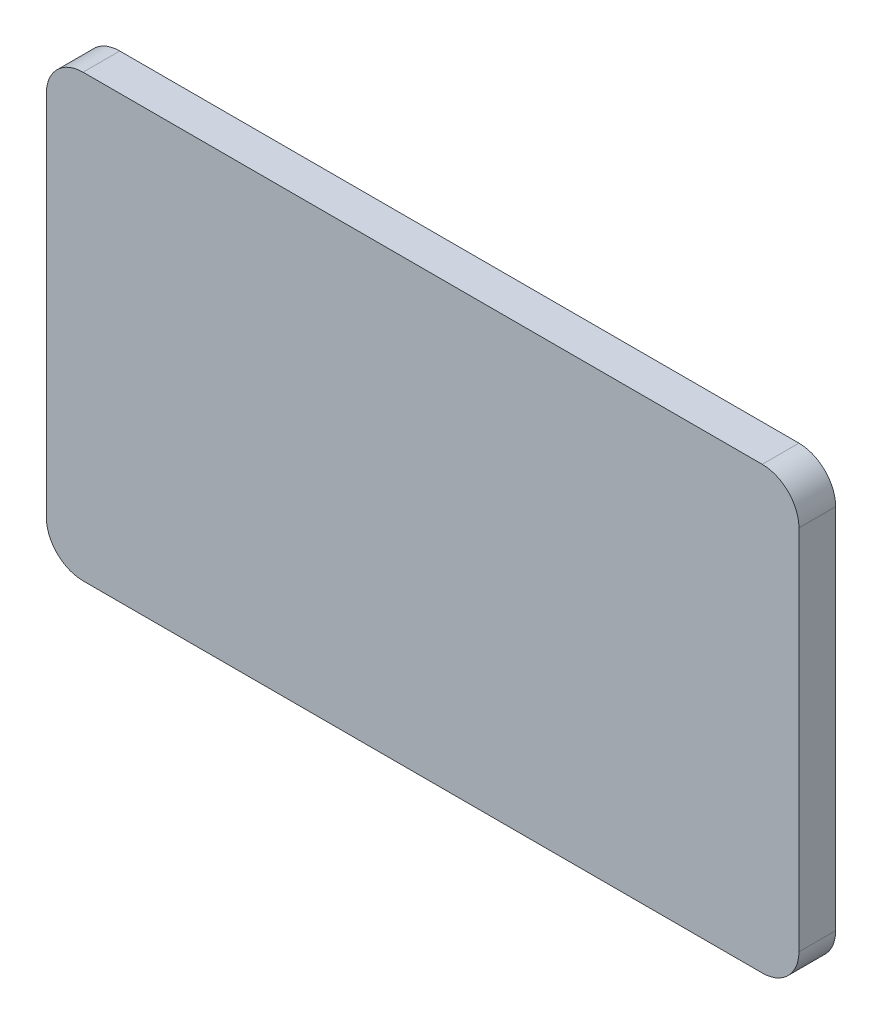
ISO-10303-21;
HEADER;
FILE_DESCRIPTION(('STEP AP214'),'2;1');
FILE_NAME('part.step','',(''),(''),'','','');
FILE_SCHEMA(('AUTOMOTIVE_DESIGN { 1 0 10303 214 1 1 1 1 }'));
ENDSEC;
DATA;
#1=APPLICATION_CONTEXT('core data for automotive mechanical design processes');
#2=APPLICATION_PROTOCOL_DEFINITION('international standard','automotive_design',2000,#1);
#3=PRODUCT_CONTEXT('',#1,'mechanical');
#4=PRODUCT('Part','Part','',(#3));
#5=PRODUCT_RELATED_PRODUCT_CATEGORY('part','',(#4));
#6=PRODUCT_DEFINITION_FORMATION('','',#4);
#7=PRODUCT_DEFINITION_CONTEXT('part definition',#1,'design');
#8=PRODUCT_DEFINITION('design','',#6,#7);
#9=PRODUCT_DEFINITION_SHAPE('','',#8);
#10=(LENGTH_UNIT() NAMED_UNIT(*) SI_UNIT(.MILLI.,.METRE.));
#11=(NAMED_UNIT(*) PLANE_ANGLE_UNIT() SI_UNIT($,.RADIAN.));
#12=(NAMED_UNIT(*) SI_UNIT($,.STERADIAN.) SOLID_ANGLE_UNIT());
#13=UNCERTAINTY_MEASURE_WITH_UNIT(LENGTH_MEASURE(1.E-05),#10,'distance_accuracy_value','');
#14=(GEOMETRIC_REPRESENTATION_CONTEXT(3) GLOBAL_UNCERTAINTY_ASSIGNED_CONTEXT((#13)) GLOBAL_UNIT_ASSIGNED_CONTEXT((#10,
#11,#12)) REPRESENTATION_CONTEXT('',''));
#15=CARTESIAN_POINT('',(0.,0.,0.));
#16=DIRECTION('',(0.,0.,1.));
#17=DIRECTION('',(1.,0.,0.));
#18=AXIS2_PLACEMENT_3D('',#15,#16,#17);
#19=CARTESIAN_POINT('',(0.,0.,2.));
#20=DIRECTION('',(1.,0.,0.));
#21=DIRECTION('',(0.,1.,0.));
#22=AXIS2_PLACEMENT_3D('',#19,#20,#21);
#23=PLANE('',#22);
#24=DIRECTION('',(0.,-1.,0.));
#25=VECTOR('',#24,1.);
#26=CARTESIAN_POINT('',(0.,0.,0.));
#27=LINE('',#26,#25);
#28=CARTESIAN_POINT('',(0.,-2.,0.));
#29=VERTEX_POINT('',#28);
#30=CARTESIAN_POINT('',(0.,-22.,0.));
#31=VERTEX_POINT('',#30);
#32=EDGE_CURVE('E142',#29,#31,#27,.T.);
#33=ORIENTED_EDGE('',*,*,#32,.T.);
#34=DIRECTION('',(0.,0.,-1.));
#35=VECTOR('',#34,1.);
#36=CARTESIAN_POINT('',(0.,-22.,2.));
#37=LINE('',#36,#35);
#38=CARTESIAN_POINT('',(0.,-22.,2.));
#39=VERTEX_POINT('',#38);
#40=EDGE_CURVE('E176',#31,#39,#37,.F.);
#41=ORIENTED_EDGE('',*,*,#40,.T.);
#42=DIRECTION('',(0.,-1.,0.));
#43=VECTOR('',#42,1.);
#44=CARTESIAN_POINT('',(0.,0.,2.));
#45=LINE('',#44,#43);
#46=CARTESIAN_POINT('',(0.,-2.,2.));
#47=VERTEX_POINT('',#46);
#48=EDGE_CURVE('E140',#47,#39,#45,.T.);
#49=ORIENTED_EDGE('',*,*,#48,.F.);
#50=DIRECTION('',(0.,0.,-1.));
#51=VECTOR('',#50,1.);
#52=CARTESIAN_POINT('',(0.,-2.,2.));
#53=LINE('',#52,#51);
#54=EDGE_CURVE('E172',#47,#29,#53,.T.);
#55=ORIENTED_EDGE('',*,*,#54,.T.);
#56=EDGE_LOOP('',(#33,#41,#49,#55));
#57=FACE_BOUND('',#56,.T.);
#58=ADVANCED_FACE('F41',(#57),#23,.F.);
#59=CARTESIAN_POINT('',(0.,-24.,2.));
#60=DIRECTION('',(0.,1.,0.));
#61=DIRECTION('',(0.,0.,1.));
#62=AXIS2_PLACEMENT_3D('',#59,#60,#61);
#63=PLANE('',#62);
#64=DIRECTION('',(1.,0.,0.));
#65=VECTOR('',#64,1.);
#66=CARTESIAN_POINT('',(0.,-24.,0.));
#67=LINE('',#66,#65);
#68=CARTESIAN_POINT('',(2.,-24.,0.));
#69=VERTEX_POINT('',#68);
#70=CARTESIAN_POINT('',(39.,-24.,0.));
#71=VERTEX_POINT('',#70);
#72=EDGE_CURVE('E136',#69,#71,#67,.T.);
#73=ORIENTED_EDGE('',*,*,#72,.T.);
#74=DIRECTION('',(0.,0.,-1.));
#75=VECTOR('',#74,1.);
#76=CARTESIAN_POINT('',(39.,-24.,2.));
#77=LINE('',#76,#75);
#78=CARTESIAN_POINT('',(39.,-24.,2.));
#79=VERTEX_POINT('',#78);
#80=EDGE_CURVE('E112',#71,#79,#77,.F.);
#81=ORIENTED_EDGE('',*,*,#80,.T.);
#82=DIRECTION('',(1.,0.,0.));
#83=VECTOR('',#82,1.);
#84=CARTESIAN_POINT('',(0.,-24.,2.));
#85=LINE('',#84,#83);
#86=CARTESIAN_POINT('',(2.,-24.,2.));
#87=VERTEX_POINT('',#86);
#88=EDGE_CURVE('E195',#87,#79,#85,.T.);
#89=ORIENTED_EDGE('',*,*,#88,.F.);
#90=DIRECTION('',(0.,0.,-1.));
#91=VECTOR('',#90,1.);
#92=CARTESIAN_POINT('',(2.,-24.,2.));
#93=LINE('',#92,#91);
#94=EDGE_CURVE('E118',#87,#69,#93,.T.);
#95=ORIENTED_EDGE('',*,*,#94,.T.);
#96=EDGE_LOOP('',(#73,#81,#89,#95));
#97=FACE_BOUND('',#96,.T.);
#98=ADVANCED_FACE('F216',(#97),#63,.F.);
#99=CARTESIAN_POINT('',(41.,0.,2.));
#100=DIRECTION('',(-1.,0.,0.));
#101=DIRECTION('',(0.,0.,1.));
#102=AXIS2_PLACEMENT_3D('',#99,#100,#101);
#103=PLANE('',#102);
#104=DIRECTION('',(0.,1.,0.));
#105=VECTOR('',#104,1.);
#106=CARTESIAN_POINT('',(41.,0.,2.));
#107=LINE('',#106,#105);
#108=CARTESIAN_POINT('',(41.,-22.,2.));
#109=VERTEX_POINT('',#108);
#110=CARTESIAN_POINT('',(41.,-2.,2.));
#111=VERTEX_POINT('',#110);
#112=EDGE_CURVE('E127',#109,#111,#107,.T.);
#113=ORIENTED_EDGE('',*,*,#112,.F.);
#114=DIRECTION('',(0.,0.,-1.));
#115=VECTOR('',#114,1.);
#116=CARTESIAN_POINT('',(41.,-22.,2.));
#117=LINE('',#116,#115);
#118=CARTESIAN_POINT('',(41.,-22.,0.));
#119=VERTEX_POINT('',#118);
#120=EDGE_CURVE('E111',#109,#119,#117,.T.);
#121=ORIENTED_EDGE('',*,*,#120,.T.);
#122=DIRECTION('',(0.,1.,0.));
#123=VECTOR('',#122,1.);
#124=CARTESIAN_POINT('',(41.,0.,0.));
#125=LINE('',#124,#123);
#126=CARTESIAN_POINT('',(41.,-2.,0.));
#127=VERTEX_POINT('',#126);
#128=EDGE_CURVE('E125',#119,#127,#125,.T.);
#129=ORIENTED_EDGE('',*,*,#128,.T.);
#130=DIRECTION('',(0.,0.,-1.));
#131=VECTOR('',#130,1.);
#132=CARTESIAN_POINT('',(41.,-2.,2.));
#133=LINE('',#132,#131);
#134=EDGE_CURVE('E130',#127,#111,#133,.F.);
#135=ORIENTED_EDGE('',*,*,#134,.T.);
#136=EDGE_LOOP('',(#113,#121,#129,#135));
#137=FACE_BOUND('',#136,.T.);
#138=ADVANCED_FACE('F124',(#137),#103,.F.);
#139=CARTESIAN_POINT('',(0.,0.,2.));
#140=DIRECTION('',(0.,-1.,0.));
#141=DIRECTION('',(0.,0.,-1.));
#142=AXIS2_PLACEMENT_3D('',#139,#140,#141);
#143=PLANE('',#142);
#144=DIRECTION('',(-1.,0.,0.));
#145=VECTOR('',#144,1.);
#146=CARTESIAN_POINT('',(0.,0.,0.));
#147=LINE('',#146,#145);
#148=CARTESIAN_POINT('',(39.,0.,0.));
#149=VERTEX_POINT('',#148);
#150=CARTESIAN_POINT('',(2.,0.,0.));
#151=VERTEX_POINT('',#150);
#152=EDGE_CURVE('E135',#149,#151,#147,.T.);
#153=ORIENTED_EDGE('',*,*,#152,.T.);
#154=DIRECTION('',(0.,0.,-1.));
#155=VECTOR('',#154,1.);
#156=CARTESIAN_POINT('',(2.,0.,2.));
#157=LINE('',#156,#155);
#158=CARTESIAN_POINT('',(2.,0.,2.));
#159=VERTEX_POINT('',#158);
#160=EDGE_CURVE('E11',#151,#159,#157,.F.);
#161=ORIENTED_EDGE('',*,*,#160,.T.);
#162=DIRECTION('',(-1.,0.,0.));
#163=VECTOR('',#162,1.);
#164=CARTESIAN_POINT('',(0.,0.,2.));
#165=LINE('',#164,#163);
#166=CARTESIAN_POINT('',(39.,0.,2.));
#167=VERTEX_POINT('',#166);
#168=EDGE_CURVE('E147',#167,#159,#165,.T.);
#169=ORIENTED_EDGE('',*,*,#168,.F.);
#170=DIRECTION('',(0.,0.,-1.));
#171=VECTOR('',#170,1.);
#172=CARTESIAN_POINT('',(39.,0.,2.));
#173=LINE('',#172,#171);
#174=EDGE_CURVE('E50',#167,#149,#173,.T.);
#175=ORIENTED_EDGE('',*,*,#174,.T.);
#176=EDGE_LOOP('',(#153,#161,#169,#175));
#177=FACE_BOUND('',#176,.T.);
#178=ADVANCED_FACE('F181',(#177),#143,.F.);
#179=CARTESIAN_POINT('',(0.,0.,2.));
#180=DIRECTION('',(0.,0.,1.));
#181=DIRECTION('',(1.,0.,0.));
#182=AXIS2_PLACEMENT_3D('',#179,#180,#181);
#183=PLANE('',#182);
#184=ORIENTED_EDGE('',*,*,#88,.T.);
#185=CARTESIAN_POINT('',(39.,-22.,2.));
#186=DIRECTION('',(0.,0.,1.));
#187=DIRECTION('',(1.,0.,0.));
#188=AXIS2_PLACEMENT_3D('',#185,#186,#187);
#189=CIRCLE('',#188,2.);
#190=EDGE_CURVE('E169',#79,#109,#189,.T.);
#191=ORIENTED_EDGE('',*,*,#190,.T.);
#192=ORIENTED_EDGE('',*,*,#112,.T.);
#193=CARTESIAN_POINT('',(39.,-2.,2.));
#194=DIRECTION('',(0.,0.,1.));
#195=DIRECTION('',(1.,0.,0.));
#196=AXIS2_PLACEMENT_3D('',#193,#194,#195);
#197=CIRCLE('',#196,2.);
#198=EDGE_CURVE('E62',#111,#167,#197,.T.);
#199=ORIENTED_EDGE('',*,*,#198,.T.);
#200=ORIENTED_EDGE('',*,*,#168,.T.);
#201=CARTESIAN_POINT('',(2.,-2.,2.));
#202=DIRECTION('',(0.,0.,1.));
#203=DIRECTION('',(1.,0.,0.));
#204=AXIS2_PLACEMENT_3D('',#201,#202,#203);
#205=CIRCLE('',#204,2.);
#206=EDGE_CURVE('E163',#159,#47,#205,.T.);
#207=ORIENTED_EDGE('',*,*,#206,.T.);
#208=ORIENTED_EDGE('',*,*,#48,.T.);
#209=CARTESIAN_POINT('',(2.,-22.,2.));
#210=DIRECTION('',(0.,0.,1.));
#211=DIRECTION('',(1.,0.,0.));
#212=AXIS2_PLACEMENT_3D('',#209,#210,#211);
#213=CIRCLE('',#212,2.);
#214=EDGE_CURVE('E166',#39,#87,#213,.T.);
#215=ORIENTED_EDGE('',*,*,#214,.T.);
#216=EDGE_LOOP('',(#184,#191,#192,#199,#200,#207,#208,#215));
#217=FACE_BOUND('',#216,.T.);
#218=ADVANCED_FACE('F205',(#217),#183,.T.);
#219=CARTESIAN_POINT('',(0.,0.,0.));
#220=DIRECTION('',(0.,0.,1.));
#221=DIRECTION('',(1.,0.,0.));
#222=AXIS2_PLACEMENT_3D('',#219,#220,#221);
#223=PLANE('',#222);
#224=ORIENTED_EDGE('',*,*,#128,.F.);
#225=CARTESIAN_POINT('',(39.,-22.,0.));
#226=DIRECTION('',(0.,0.,1.));
#227=DIRECTION('',(1.,0.,0.));
#228=AXIS2_PLACEMENT_3D('',#225,#226,#227);
#229=CIRCLE('',#228,2.);
#230=EDGE_CURVE('E107',#119,#71,#229,.F.);
#231=ORIENTED_EDGE('',*,*,#230,.T.);
#232=ORIENTED_EDGE('',*,*,#72,.F.);
#233=CARTESIAN_POINT('',(2.,-22.,0.));
#234=DIRECTION('',(0.,0.,1.));
#235=DIRECTION('',(1.,0.,0.));
#236=AXIS2_PLACEMENT_3D('',#233,#234,#235);
#237=CIRCLE('',#236,2.);
#238=EDGE_CURVE('E119',#69,#31,#237,.F.);
#239=ORIENTED_EDGE('',*,*,#238,.T.);
#240=ORIENTED_EDGE('',*,*,#32,.F.);
#241=CARTESIAN_POINT('',(2.,-2.,0.));
#242=DIRECTION('',(0.,0.,1.));
#243=DIRECTION('',(1.,0.,0.));
#244=AXIS2_PLACEMENT_3D('',#241,#242,#243);
#245=CIRCLE('',#244,2.);
#246=EDGE_CURVE('E151',#29,#151,#245,.F.);
#247=ORIENTED_EDGE('',*,*,#246,.T.);
#248=ORIENTED_EDGE('',*,*,#152,.F.);
#249=CARTESIAN_POINT('',(39.,-2.,0.));
#250=DIRECTION('',(0.,0.,1.));
#251=DIRECTION('',(1.,0.,0.));
#252=AXIS2_PLACEMENT_3D('',#249,#250,#251);
#253=CIRCLE('',#252,2.);
#254=EDGE_CURVE('E129',#149,#127,#253,.F.);
#255=ORIENTED_EDGE('',*,*,#254,.T.);
#256=EDGE_LOOP('',(#224,#231,#232,#239,#240,#247,#248,#255));
#257=FACE_BOUND('',#256,.T.);
#258=ADVANCED_FACE('F132',(#257),#223,.F.);
#259=CARTESIAN_POINT('',(39.,-22.,2.));
#260=DIRECTION('',(0.,0.,-1.));
#261=DIRECTION('',(-1.,0.,0.));
#262=AXIS2_PLACEMENT_3D('',#259,#260,#261);
#263=CYLINDRICAL_SURFACE('',#262,2.);
#264=ORIENTED_EDGE('',*,*,#190,.F.);
#265=ORIENTED_EDGE('',*,*,#80,.F.);
#266=ORIENTED_EDGE('',*,*,#230,.F.);
#267=ORIENTED_EDGE('',*,*,#120,.F.);
#268=EDGE_LOOP('',(#264,#265,#266,#267));
#269=FACE_BOUND('',#268,.T.);
#270=ADVANCED_FACE('F110',(#269),#263,.T.);
#271=CARTESIAN_POINT('',(2.,-22.,2.));
#272=DIRECTION('',(0.,0.,-1.));
#273=DIRECTION('',(-1.,0.,0.));
#274=AXIS2_PLACEMENT_3D('',#271,#272,#273);
#275=CYLINDRICAL_SURFACE('',#274,2.);
#276=ORIENTED_EDGE('',*,*,#214,.F.);
#277=ORIENTED_EDGE('',*,*,#40,.F.);
#278=ORIENTED_EDGE('',*,*,#238,.F.);
#279=ORIENTED_EDGE('',*,*,#94,.F.);
#280=EDGE_LOOP('',(#276,#277,#278,#279));
#281=FACE_BOUND('',#280,.T.);
#282=ADVANCED_FACE('F227',(#281),#275,.T.);
#283=CARTESIAN_POINT('',(2.,-2.,2.));
#284=DIRECTION('',(0.,0.,-1.));
#285=DIRECTION('',(-1.,0.,0.));
#286=AXIS2_PLACEMENT_3D('',#283,#284,#285);
#287=CYLINDRICAL_SURFACE('',#286,2.);
#288=ORIENTED_EDGE('',*,*,#206,.F.);
#289=ORIENTED_EDGE('',*,*,#160,.F.);
#290=ORIENTED_EDGE('',*,*,#246,.F.);
#291=ORIENTED_EDGE('',*,*,#54,.F.);
#292=EDGE_LOOP('',(#288,#289,#290,#291));
#293=FACE_BOUND('',#292,.T.);
#294=ADVANCED_FACE('F188',(#293),#287,.T.);
#295=CARTESIAN_POINT('',(39.,-2.,2.));
#296=DIRECTION('',(0.,0.,-1.));
#297=DIRECTION('',(-1.,0.,0.));
#298=AXIS2_PLACEMENT_3D('',#295,#296,#297);
#299=CYLINDRICAL_SURFACE('',#298,2.);
#300=ORIENTED_EDGE('',*,*,#198,.F.);
#301=ORIENTED_EDGE('',*,*,#134,.F.);
#302=ORIENTED_EDGE('',*,*,#254,.F.);
#303=ORIENTED_EDGE('',*,*,#174,.F.);
#304=EDGE_LOOP('',(#300,#301,#302,#303));
#305=FACE_BOUND('',#304,.T.);
#306=ADVANCED_FACE('F43',(#305),#299,.T.);
#307=CLOSED_SHELL('',(#58,#98,#138,#178,#218,#258,#270,#282,#294,#306));
#308=MANIFOLD_SOLID_BREP('B2',#307);
#309=ADVANCED_BREP_SHAPE_REPRESENTATION('',(#18,#308),#14);
#310=SHAPE_DEFINITION_REPRESENTATION(#9,#309);
ENDSEC;
END-ISO-10303-21;
